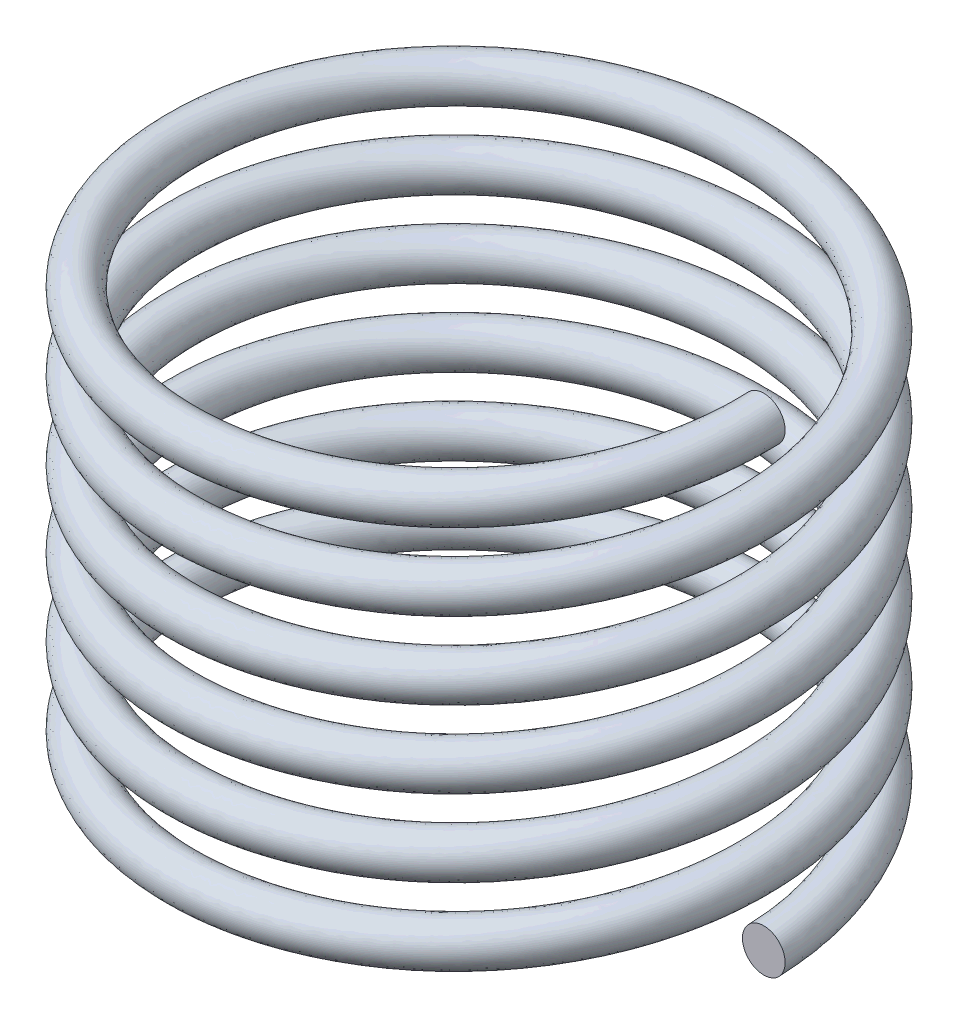
ISO-10303-21;
HEADER;
FILE_DESCRIPTION(('STEP AP214'),'2;1');
FILE_NAME('part.step','',(''),(''),'','','');
FILE_SCHEMA(('AUTOMOTIVE_DESIGN { 1 0 10303 214 1 1 1 1 }'));
ENDSEC;
DATA;
#1=APPLICATION_CONTEXT('core data for automotive mechanical design processes');
#2=APPLICATION_PROTOCOL_DEFINITION('international standard','automotive_design',2000,#1);
#3=PRODUCT_CONTEXT('',#1,'mechanical');
#4=PRODUCT('Part','Part','',(#3));
#5=PRODUCT_RELATED_PRODUCT_CATEGORY('part','',(#4));
#6=PRODUCT_DEFINITION_FORMATION('','',#4);
#7=PRODUCT_DEFINITION_CONTEXT('part definition',#1,'design');
#8=PRODUCT_DEFINITION('design','',#6,#7);
#9=PRODUCT_DEFINITION_SHAPE('','',#8);
#10=(LENGTH_UNIT() NAMED_UNIT(*) SI_UNIT(.MILLI.,.METRE.));
#11=(NAMED_UNIT(*) PLANE_ANGLE_UNIT() SI_UNIT($,.RADIAN.));
#12=(NAMED_UNIT(*) SI_UNIT($,.STERADIAN.) SOLID_ANGLE_UNIT());
#13=UNCERTAINTY_MEASURE_WITH_UNIT(LENGTH_MEASURE(1.E-05),#10,'distance_accuracy_value','');
#14=(GEOMETRIC_REPRESENTATION_CONTEXT(3) GLOBAL_UNCERTAINTY_ASSIGNED_CONTEXT((#13)) GLOBAL_UNIT_ASSIGNED_CONTEXT((#10,
#11,#12)) REPRESENTATION_CONTEXT('',''));
#15=CARTESIAN_POINT('',(0.,0.,0.));
#16=DIRECTION('',(0.,0.,1.));
#17=DIRECTION('',(1.,0.,0.));
#18=AXIS2_PLACEMENT_3D('',#15,#16,#17);
#19=CARTESIAN_POINT('',(11.3409090909091,13.8094886875501,0.));
#20=DIRECTION('',(0.,0.,1.));
#21=DIRECTION('',(1.,0.,0.));
#22=AXIS2_PLACEMENT_3D('',#19,#20,#21);
#23=PLANE('',#22);
#24=CARTESIAN_POINT('',(11.3409090909091,13.8094886875501,0.));
#25=DIRECTION('',(0.,0.,1.));
#26=DIRECTION('',(1.,0.,0.));
#27=AXIS2_PLACEMENT_3D('',#24,#25,#26);
#28=CIRCLE('',#27,1.5);
#29=CARTESIAN_POINT('',(12.8409090909091,13.8094886875501,0.));
#30=VERTEX_POINT('',#29);
#31=EDGE_CURVE('E39',#30,#30,#28,.T.);
#32=ORIENTED_EDGE('',*,*,#31,.F.);
#33=EDGE_LOOP('',(#32));
#34=FACE_BOUND('',#33,.T.);
#35=ADVANCED_FACE('F33',(#34),#23,.F.);
#36=CARTESIAN_POINT('',(11.3409090909091,-18.5768749488135,1.6759110426447E-12));
#37=DIRECTION('',(0.,0.,1.));
#38=DIRECTION('',(1.,0.,0.));
#39=AXIS2_PLACEMENT_3D('',#36,#37,#38);
#40=PLANE('',#39);
#41=CARTESIAN_POINT('',(11.3409090909091,-18.5768749488135,1.6759110426447E-12));
#42=DIRECTION('',(0.,0.,1.));
#43=DIRECTION('',(1.,0.,0.));
#44=AXIS2_PLACEMENT_3D('',#41,#42,#43);
#45=CIRCLE('',#44,1.5);
#46=CARTESIAN_POINT('',(12.8409090909091,-18.5768749488135,1.80160437084306E-12));
#47=VERTEX_POINT('',#46);
#48=EDGE_CURVE('E10',#47,#47,#45,.T.);
#49=ORIENTED_EDGE('',*,*,#48,.T.);
#50=EDGE_LOOP('',(#49));
#51=FACE_BOUND('',#50,.T.);
#52=ADVANCED_FACE('F48',(#51),#40,.T.);
#53=CARTESIAN_POINT('',(12.8409090909091,13.8094886875501,0.));
#54=CARTESIAN_POINT('',(12.8409090909091,13.3596780814895,12.413030787577));
#55=CARTESIAN_POINT('',(2.0909090909091,12.9098674754289,18.6195461813654));
#56=CARTESIAN_POINT('',(-8.6590909090909,12.4600568693683,24.8260615751539));
#57=CARTESIAN_POINT('',(-19.4090909090909,12.0102462633077,18.6195461813654));
#58=CARTESIAN_POINT('',(-30.1590909090909,11.5604356572471,12.413030787577));
#59=CARTESIAN_POINT('',(-30.1590909090909,11.1106250511865,0.));
#60=CARTESIAN_POINT('',(-30.1590909090909,10.6608144451259,-12.4130307875769));
#61=CARTESIAN_POINT('',(-19.4090909090909,10.2110038390653,-18.6195461813654));
#62=CARTESIAN_POINT('',(-8.65909090909091,9.76119323300465,-24.8260615751539));
#63=CARTESIAN_POINT('',(2.09090909090908,9.31138262694405,-18.6195461813654));
#64=CARTESIAN_POINT('',(12.8409090909091,8.86157202088344,-12.413030787577));
#65=CARTESIAN_POINT('',(12.8409090909091,8.41176141482284,0.));
#66=CARTESIAN_POINT('',(12.8409090909091,7.96195080876223,12.413030787577));
#67=CARTESIAN_POINT('',(2.0909090909091,7.51214020270163,18.6195461813654));
#68=CARTESIAN_POINT('',(-8.6590909090909,7.06232959664102,24.8260615751539));
#69=CARTESIAN_POINT('',(-19.4090909090909,6.61251899058042,18.6195461813654));
#70=CARTESIAN_POINT('',(-30.1590909090909,6.16270838451981,12.413030787577));
#71=CARTESIAN_POINT('',(-30.1590909090909,5.71289777845921,0.));
#72=CARTESIAN_POINT('',(-30.1590909090909,5.2630871723986,-12.4130307875769));
#73=CARTESIAN_POINT('',(-19.4090909090909,4.813276566338,-18.6195461813654));
#74=CARTESIAN_POINT('',(-8.65909090909091,4.3634659602774,-24.8260615751539));
#75=CARTESIAN_POINT('',(2.09090909090908,3.91365535421679,-18.6195461813654));
#76=CARTESIAN_POINT('',(12.8409090909091,3.46384474815619,-12.413030787577));
#77=CARTESIAN_POINT('',(12.8409090909091,3.01403414209558,0.));
#78=CARTESIAN_POINT('',(12.8409090909091,2.56422353603498,12.413030787577));
#79=CARTESIAN_POINT('',(2.0909090909091,2.11441292997438,18.6195461813654));
#80=CARTESIAN_POINT('',(-8.6590909090909,1.66460232391377,24.8260615751539));
#81=CARTESIAN_POINT('',(-19.4090909090909,1.21479171785317,18.6195461813654));
#82=CARTESIAN_POINT('',(-30.1590909090909,0.764981111792563,12.413030787577));
#83=CARTESIAN_POINT('',(-30.1590909090909,0.315170505731958,0.));
#84=CARTESIAN_POINT('',(-30.1590909090909,-0.134640100328647,-12.4130307875769));
#85=CARTESIAN_POINT('',(-19.4090909090909,-0.584450706389251,-18.6195461813654));
#86=CARTESIAN_POINT('',(-8.65909090909091,-1.03426131244986,-24.8260615751539));
#87=CARTESIAN_POINT('',(2.09090909090908,-1.48407191851046,-18.6195461813654));
#88=CARTESIAN_POINT('',(12.8409090909091,-1.93388252457106,-12.413030787577));
#89=CARTESIAN_POINT('',(12.8409090909091,-2.38369313063167,0.));
#90=CARTESIAN_POINT('',(12.8409090909091,-2.83350373669227,12.413030787577));
#91=CARTESIAN_POINT('',(2.0909090909091,-3.28331434275288,18.6195461813654));
#92=CARTESIAN_POINT('',(-8.6590909090909,-3.73312494881348,24.8260615751539));
#93=CARTESIAN_POINT('',(-19.4090909090909,-4.18293555487409,18.6195461813654));
#94=CARTESIAN_POINT('',(-30.1590909090909,-4.63274616093469,12.413030787577));
#95=CARTESIAN_POINT('',(-30.1590909090909,-5.08255676699529,0.));
#96=CARTESIAN_POINT('',(-30.1590909090909,-5.5323673730559,-12.4130307875769));
#97=CARTESIAN_POINT('',(-19.4090909090909,-5.9821779791165,-18.6195461813654));
#98=CARTESIAN_POINT('',(-8.65909090909091,-6.43198858517711,-24.8260615751539));
#99=CARTESIAN_POINT('',(2.09090909090908,-6.88179919123771,-18.6195461813654));
#100=CARTESIAN_POINT('',(12.8409090909091,-7.33160979729832,-12.413030787577));
#101=CARTESIAN_POINT('',(12.8409090909091,-7.78142040335892,0.));
#102=CARTESIAN_POINT('',(12.8409090909091,-8.23123100941952,12.413030787577));
#103=CARTESIAN_POINT('',(2.0909090909091,-8.68104161548013,18.6195461813654));
#104=CARTESIAN_POINT('',(-8.6590909090909,-9.13085222154073,24.8260615751539));
#105=CARTESIAN_POINT('',(-19.4090909090909,-9.58066282760134,18.6195461813654));
#106=CARTESIAN_POINT('',(-30.1590909090909,-10.0304734336619,12.413030787577));
#107=CARTESIAN_POINT('',(-30.1590909090909,-10.4802840397225,0.));
#108=CARTESIAN_POINT('',(-30.1590909090909,-10.9300946457832,-12.4130307875769));
#109=CARTESIAN_POINT('',(-19.4090909090909,-11.3799052518438,-18.6195461813654));
#110=CARTESIAN_POINT('',(-8.65909090909091,-11.8297158579044,-24.8260615751539));
#111=CARTESIAN_POINT('',(2.09090909090908,-12.279526463965,-18.6195461813654));
#112=CARTESIAN_POINT('',(12.8409090909091,-12.7293370700256,-12.413030787577));
#113=CARTESIAN_POINT('',(12.8409090909091,-13.1791476760862,0.));
#114=CARTESIAN_POINT('',(12.8409090909091,-13.6289582821468,12.413030787577));
#115=CARTESIAN_POINT('',(2.0909090909091,-14.0787688882074,18.6195461813654));
#116=CARTESIAN_POINT('',(-8.6590909090909,-14.528579494268,24.8260615751539));
#117=CARTESIAN_POINT('',(-19.4090909090909,-14.9783901003286,18.6195461813654));
#118=CARTESIAN_POINT('',(-30.1590909090909,-15.4282007063892,12.413030787577));
#119=CARTESIAN_POINT('',(-30.1590909090909,-15.8780113124498,0.));
#120=CARTESIAN_POINT('',(-30.1590909090909,-16.3278219185104,-12.4130307875769));
#121=CARTESIAN_POINT('',(-19.4090909090909,-16.777632524571,-18.6195461813654));
#122=CARTESIAN_POINT('',(-8.65909090909091,-17.2274431306316,-24.8260615751539));
#123=CARTESIAN_POINT('',(2.09090909090908,-17.6772537366922,-18.6195461813654));
#124=CARTESIAN_POINT('',(12.8409090909091,-18.1270643427528,-12.413030787577));
#125=CARTESIAN_POINT('',(12.8409090909091,-18.5768749488134,0.));
#126=CARTESIAN_POINT('',(12.8409090909091,16.8094886875501,0.));
#127=CARTESIAN_POINT('',(12.8409090909091,16.3596780814895,12.413030787577));
#128=CARTESIAN_POINT('',(2.0909090909091,15.9098674754289,18.6195461813654));
#129=CARTESIAN_POINT('',(-8.6590909090909,15.4600568693683,24.8260615751539));
#130=CARTESIAN_POINT('',(-19.4090909090909,15.0102462633077,18.6195461813654));
#131=CARTESIAN_POINT('',(-30.1590909090909,14.5604356572471,12.413030787577));
#132=CARTESIAN_POINT('',(-30.1590909090909,14.1106250511865,0.));
#133=CARTESIAN_POINT('',(-30.1590909090909,13.6608144451259,-12.4130307875769));
#134=CARTESIAN_POINT('',(-19.4090909090909,13.2110038390653,-18.6195461813654));
#135=CARTESIAN_POINT('',(-8.65909090909091,12.7611932330046,-24.8260615751539));
#136=CARTESIAN_POINT('',(2.09090909090908,12.311382626944,-18.6195461813654));
#137=CARTESIAN_POINT('',(12.8409090909091,11.8615720208834,-12.413030787577));
#138=CARTESIAN_POINT('',(12.8409090909091,11.4117614148228,0.));
#139=CARTESIAN_POINT('',(12.8409090909091,10.9619508087622,12.413030787577));
#140=CARTESIAN_POINT('',(2.0909090909091,10.5121402027016,18.6195461813654));
#141=CARTESIAN_POINT('',(-8.6590909090909,10.062329596641,24.8260615751539));
#142=CARTESIAN_POINT('',(-19.4090909090909,9.61251899058042,18.6195461813654));
#143=CARTESIAN_POINT('',(-30.1590909090909,9.16270838451981,12.413030787577));
#144=CARTESIAN_POINT('',(-30.1590909090909,8.71289777845921,0.));
#145=CARTESIAN_POINT('',(-30.1590909090909,8.2630871723986,-12.4130307875769));
#146=CARTESIAN_POINT('',(-19.4090909090909,7.813276566338,-18.6195461813654));
#147=CARTESIAN_POINT('',(-8.65909090909091,7.36346596027739,-24.8260615751539));
#148=CARTESIAN_POINT('',(2.09090909090908,6.91365535421679,-18.6195461813654));
#149=CARTESIAN_POINT('',(12.8409090909091,6.46384474815619,-12.413030787577));
#150=CARTESIAN_POINT('',(12.8409090909091,6.01403414209558,0.));
#151=CARTESIAN_POINT('',(12.8409090909091,5.56422353603498,12.413030787577));
#152=CARTESIAN_POINT('',(2.0909090909091,5.11441292997437,18.6195461813654));
#153=CARTESIAN_POINT('',(-8.6590909090909,4.66460232391377,24.8260615751539));
#154=CARTESIAN_POINT('',(-19.4090909090909,4.21479171785316,18.6195461813654));
#155=CARTESIAN_POINT('',(-30.1590909090909,3.76498111179256,12.413030787577));
#156=CARTESIAN_POINT('',(-30.1590909090909,3.31517050573196,0.));
#157=CARTESIAN_POINT('',(-30.1590909090909,2.86535989967135,-12.4130307875769));
#158=CARTESIAN_POINT('',(-19.4090909090909,2.41554929361075,-18.6195461813654));
#159=CARTESIAN_POINT('',(-8.65909090909091,1.96573868755014,-24.8260615751539));
#160=CARTESIAN_POINT('',(2.09090909090908,1.51592808148954,-18.6195461813654));
#161=CARTESIAN_POINT('',(12.8409090909091,1.06611747542893,-12.413030787577));
#162=CARTESIAN_POINT('',(12.8409090909091,0.616306869368328,0.));
#163=CARTESIAN_POINT('',(12.8409090909091,0.166496263307725,12.413030787577));
#164=CARTESIAN_POINT('',(2.0909090909091,-0.283314342752881,18.6195461813654));
#165=CARTESIAN_POINT('',(-8.6590909090909,-0.733124948813484,24.8260615751539));
#166=CARTESIAN_POINT('',(-19.4090909090909,-1.18293555487409,18.6195461813654));
#167=CARTESIAN_POINT('',(-30.1590909090909,-1.63274616093469,12.413030787577));
#168=CARTESIAN_POINT('',(-30.1590909090909,-2.0825567669953,0.));
#169=CARTESIAN_POINT('',(-30.1590909090909,-2.5323673730559,-12.4130307875769));
#170=CARTESIAN_POINT('',(-19.4090909090909,-2.98217797911651,-18.6195461813654));
#171=CARTESIAN_POINT('',(-8.65909090909091,-3.43198858517711,-24.8260615751539));
#172=CARTESIAN_POINT('',(2.09090909090908,-3.88179919123772,-18.6195461813654));
#173=CARTESIAN_POINT('',(12.8409090909091,-4.33160979729832,-12.413030787577));
#174=CARTESIAN_POINT('',(12.8409090909091,-4.78142040335892,0.));
#175=CARTESIAN_POINT('',(12.8409090909091,-5.23123100941953,12.413030787577));
#176=CARTESIAN_POINT('',(2.0909090909091,-5.68104161548013,18.6195461813654));
#177=CARTESIAN_POINT('',(-8.6590909090909,-6.13085222154074,24.8260615751539));
#178=CARTESIAN_POINT('',(-19.4090909090909,-6.58066282760134,18.6195461813654));
#179=CARTESIAN_POINT('',(-30.1590909090909,-7.03047343366195,12.413030787577));
#180=CARTESIAN_POINT('',(-30.1590909090909,-7.48028403972255,0.));
#181=CARTESIAN_POINT('',(-30.1590909090909,-7.93009464578315,-12.4130307875769));
#182=CARTESIAN_POINT('',(-19.4090909090909,-8.37990525184376,-18.6195461813654));
#183=CARTESIAN_POINT('',(-8.65909090909091,-8.82971585790436,-24.8260615751539));
#184=CARTESIAN_POINT('',(2.09090909090908,-9.27952646396497,-18.6195461813654));
#185=CARTESIAN_POINT('',(12.8409090909091,-9.72933707002557,-12.413030787577));
#186=CARTESIAN_POINT('',(12.8409090909091,-10.1791476760862,0.));
#187=CARTESIAN_POINT('',(12.8409090909091,-10.6289582821468,12.413030787577));
#188=CARTESIAN_POINT('',(2.0909090909091,-11.0787688882074,18.6195461813654));
#189=CARTESIAN_POINT('',(-8.6590909090909,-11.528579494268,24.8260615751539));
#190=CARTESIAN_POINT('',(-19.4090909090909,-11.9783901003286,18.6195461813654));
#191=CARTESIAN_POINT('',(-30.1590909090909,-12.4282007063892,12.413030787577));
#192=CARTESIAN_POINT('',(-30.1590909090909,-12.8780113124498,0.));
#193=CARTESIAN_POINT('',(-30.1590909090909,-13.3278219185104,-12.4130307875769));
#194=CARTESIAN_POINT('',(-19.4090909090909,-13.777632524571,-18.6195461813654));
#195=CARTESIAN_POINT('',(-8.65909090909091,-14.2274431306316,-24.8260615751539));
#196=CARTESIAN_POINT('',(2.09090909090908,-14.6772537366922,-18.6195461813654));
#197=CARTESIAN_POINT('',(12.8409090909091,-15.1270643427528,-12.413030787577));
#198=CARTESIAN_POINT('',(12.8409090909091,-15.5768749488134,0.));
#199=CARTESIAN_POINT('',(9.8409090909091,16.8094886875501,0.));
#200=CARTESIAN_POINT('',(9.8409090909091,16.3596780814895,10.6809799800081));
#201=CARTESIAN_POINT('',(0.5909090909091,15.9098674754289,16.0214699700121));
#202=CARTESIAN_POINT('',(-8.6590909090909,15.4600568693683,21.3619599600162));
#203=CARTESIAN_POINT('',(-17.9090909090909,15.0102462633077,16.0214699700121));
#204=CARTESIAN_POINT('',(-27.1590909090909,14.5604356572471,10.6809799800081));
#205=CARTESIAN_POINT('',(-27.1590909090909,14.1106250511865,0.));
#206=CARTESIAN_POINT('',(-27.1590909090909,13.6608144451259,-10.6809799800081));
#207=CARTESIAN_POINT('',(-17.9090909090909,13.2110038390653,-16.0214699700121));
#208=CARTESIAN_POINT('',(-8.65909090909091,12.7611932330046,-21.3619599600162));
#209=CARTESIAN_POINT('',(0.590909090909086,12.311382626944,-16.0214699700121));
#210=CARTESIAN_POINT('',(9.84090909090909,11.8615720208834,-10.6809799800081));
#211=CARTESIAN_POINT('',(9.8409090909091,11.4117614148228,0.));
#212=CARTESIAN_POINT('',(9.8409090909091,10.9619508087622,10.6809799800081));
#213=CARTESIAN_POINT('',(0.5909090909091,10.5121402027016,16.0214699700121));
#214=CARTESIAN_POINT('',(-8.6590909090909,10.062329596641,21.3619599600162));
#215=CARTESIAN_POINT('',(-17.9090909090909,9.61251899058042,16.0214699700121));
#216=CARTESIAN_POINT('',(-27.1590909090909,9.16270838451981,10.6809799800081));
#217=CARTESIAN_POINT('',(-27.1590909090909,8.71289777845921,0.));
#218=CARTESIAN_POINT('',(-27.1590909090909,8.2630871723986,-10.6809799800081));
#219=CARTESIAN_POINT('',(-17.9090909090909,7.813276566338,-16.0214699700121));
#220=CARTESIAN_POINT('',(-8.65909090909091,7.36346596027739,-21.3619599600162));
#221=CARTESIAN_POINT('',(0.590909090909086,6.91365535421679,-16.0214699700121));
#222=CARTESIAN_POINT('',(9.84090909090909,6.46384474815619,-10.6809799800081));
#223=CARTESIAN_POINT('',(9.8409090909091,6.01403414209558,0.));
#224=CARTESIAN_POINT('',(9.8409090909091,5.56422353603498,10.6809799800081));
#225=CARTESIAN_POINT('',(0.5909090909091,5.11441292997437,16.0214699700121));
#226=CARTESIAN_POINT('',(-8.6590909090909,4.66460232391377,21.3619599600162));
#227=CARTESIAN_POINT('',(-17.9090909090909,4.21479171785316,16.0214699700121));
#228=CARTESIAN_POINT('',(-27.1590909090909,3.76498111179256,10.6809799800081));
#229=CARTESIAN_POINT('',(-27.1590909090909,3.31517050573196,0.));
#230=CARTESIAN_POINT('',(-27.1590909090909,2.86535989967135,-10.6809799800081));
#231=CARTESIAN_POINT('',(-17.9090909090909,2.41554929361075,-16.0214699700121));
#232=CARTESIAN_POINT('',(-8.65909090909091,1.96573868755014,-21.3619599600162));
#233=CARTESIAN_POINT('',(0.590909090909086,1.51592808148954,-16.0214699700121));
#234=CARTESIAN_POINT('',(9.84090909090909,1.06611747542893,-10.6809799800081));
#235=CARTESIAN_POINT('',(9.8409090909091,0.616306869368328,0.));
#236=CARTESIAN_POINT('',(9.8409090909091,0.166496263307725,10.6809799800081));
#237=CARTESIAN_POINT('',(0.5909090909091,-0.283314342752881,16.0214699700121));
#238=CARTESIAN_POINT('',(-8.6590909090909,-0.733124948813484,21.3619599600162));
#239=CARTESIAN_POINT('',(-17.9090909090909,-1.18293555487409,16.0214699700121));
#240=CARTESIAN_POINT('',(-27.1590909090909,-1.63274616093469,10.6809799800081));
#241=CARTESIAN_POINT('',(-27.1590909090909,-2.0825567669953,0.));
#242=CARTESIAN_POINT('',(-27.1590909090909,-2.5323673730559,-10.6809799800081));
#243=CARTESIAN_POINT('',(-17.9090909090909,-2.98217797911651,-16.0214699700121));
#244=CARTESIAN_POINT('',(-8.65909090909091,-3.43198858517711,-21.3619599600162));
#245=CARTESIAN_POINT('',(0.590909090909086,-3.88179919123772,-16.0214699700121));
#246=CARTESIAN_POINT('',(9.84090909090909,-4.33160979729832,-10.6809799800081));
#247=CARTESIAN_POINT('',(9.8409090909091,-4.78142040335892,0.));
#248=CARTESIAN_POINT('',(9.8409090909091,-5.23123100941953,10.6809799800081));
#249=CARTESIAN_POINT('',(0.5909090909091,-5.68104161548013,16.0214699700121));
#250=CARTESIAN_POINT('',(-8.6590909090909,-6.13085222154074,21.3619599600162));
#251=CARTESIAN_POINT('',(-17.9090909090909,-6.58066282760134,16.0214699700121));
#252=CARTESIAN_POINT('',(-27.1590909090909,-7.03047343366195,10.6809799800081));
#253=CARTESIAN_POINT('',(-27.1590909090909,-7.48028403972255,0.));
#254=CARTESIAN_POINT('',(-27.1590909090909,-7.93009464578315,-10.6809799800081));
#255=CARTESIAN_POINT('',(-17.9090909090909,-8.37990525184376,-16.0214699700121));
#256=CARTESIAN_POINT('',(-8.65909090909091,-8.82971585790436,-21.3619599600162));
#257=CARTESIAN_POINT('',(0.590909090909086,-9.27952646396497,-16.0214699700121));
#258=CARTESIAN_POINT('',(9.84090909090909,-9.72933707002557,-10.6809799800081));
#259=CARTESIAN_POINT('',(9.8409090909091,-10.1791476760862,0.));
#260=CARTESIAN_POINT('',(9.8409090909091,-10.6289582821468,10.6809799800081));
#261=CARTESIAN_POINT('',(0.5909090909091,-11.0787688882074,16.0214699700121));
#262=CARTESIAN_POINT('',(-8.6590909090909,-11.528579494268,21.3619599600162));
#263=CARTESIAN_POINT('',(-17.9090909090909,-11.9783901003286,16.0214699700121));
#264=CARTESIAN_POINT('',(-27.1590909090909,-12.4282007063892,10.6809799800081));
#265=CARTESIAN_POINT('',(-27.1590909090909,-12.8780113124498,0.));
#266=CARTESIAN_POINT('',(-27.1590909090909,-13.3278219185104,-10.6809799800081));
#267=CARTESIAN_POINT('',(-17.9090909090909,-13.777632524571,-16.0214699700121));
#268=CARTESIAN_POINT('',(-8.65909090909091,-14.2274431306316,-21.3619599600162));
#269=CARTESIAN_POINT('',(0.590909090909086,-14.6772537366922,-16.0214699700121));
#270=CARTESIAN_POINT('',(9.84090909090909,-15.1270643427528,-10.6809799800081));
#271=CARTESIAN_POINT('',(9.8409090909091,-15.5768749488134,0.));
#272=CARTESIAN_POINT('',(9.8409090909091,13.8094886875501,0.));
#273=CARTESIAN_POINT('',(9.8409090909091,13.3596780814895,10.6809799800081));
#274=CARTESIAN_POINT('',(0.5909090909091,12.9098674754289,16.0214699700121));
#275=CARTESIAN_POINT('',(-8.6590909090909,12.4600568693683,21.3619599600162));
#276=CARTESIAN_POINT('',(-17.9090909090909,12.0102462633077,16.0214699700121));
#277=CARTESIAN_POINT('',(-27.1590909090909,11.5604356572471,10.6809799800081));
#278=CARTESIAN_POINT('',(-27.1590909090909,11.1106250511865,0.));
#279=CARTESIAN_POINT('',(-27.1590909090909,10.6608144451259,-10.6809799800081));
#280=CARTESIAN_POINT('',(-17.9090909090909,10.2110038390653,-16.0214699700121));
#281=CARTESIAN_POINT('',(-8.65909090909091,9.76119323300465,-21.3619599600162));
#282=CARTESIAN_POINT('',(0.590909090909086,9.31138262694405,-16.0214699700121));
#283=CARTESIAN_POINT('',(9.84090909090909,8.86157202088344,-10.6809799800081));
#284=CARTESIAN_POINT('',(9.8409090909091,8.41176141482284,0.));
#285=CARTESIAN_POINT('',(9.8409090909091,7.96195080876223,10.6809799800081));
#286=CARTESIAN_POINT('',(0.5909090909091,7.51214020270163,16.0214699700121));
#287=CARTESIAN_POINT('',(-8.6590909090909,7.06232959664102,21.3619599600162));
#288=CARTESIAN_POINT('',(-17.9090909090909,6.61251899058042,16.0214699700121));
#289=CARTESIAN_POINT('',(-27.1590909090909,6.16270838451981,10.6809799800081));
#290=CARTESIAN_POINT('',(-27.1590909090909,5.71289777845921,0.));
#291=CARTESIAN_POINT('',(-27.1590909090909,5.2630871723986,-10.6809799800081));
#292=CARTESIAN_POINT('',(-17.9090909090909,4.813276566338,-16.0214699700121));
#293=CARTESIAN_POINT('',(-8.65909090909091,4.3634659602774,-21.3619599600162));
#294=CARTESIAN_POINT('',(0.590909090909086,3.91365535421679,-16.0214699700121));
#295=CARTESIAN_POINT('',(9.84090909090909,3.46384474815619,-10.6809799800081));
#296=CARTESIAN_POINT('',(9.8409090909091,3.01403414209558,0.));
#297=CARTESIAN_POINT('',(9.8409090909091,2.56422353603498,10.6809799800081));
#298=CARTESIAN_POINT('',(0.5909090909091,2.11441292997438,16.0214699700121));
#299=CARTESIAN_POINT('',(-8.6590909090909,1.66460232391377,21.3619599600162));
#300=CARTESIAN_POINT('',(-17.9090909090909,1.21479171785317,16.0214699700121));
#301=CARTESIAN_POINT('',(-27.1590909090909,0.764981111792563,10.6809799800081));
#302=CARTESIAN_POINT('',(-27.1590909090909,0.315170505731958,0.));
#303=CARTESIAN_POINT('',(-27.1590909090909,-0.134640100328647,-10.6809799800081));
#304=CARTESIAN_POINT('',(-17.9090909090909,-0.584450706389251,-16.0214699700121));
#305=CARTESIAN_POINT('',(-8.65909090909091,-1.03426131244986,-21.3619599600162));
#306=CARTESIAN_POINT('',(0.590909090909086,-1.48407191851046,-16.0214699700121));
#307=CARTESIAN_POINT('',(9.84090909090909,-1.93388252457106,-10.6809799800081));
#308=CARTESIAN_POINT('',(9.8409090909091,-2.38369313063167,0.));
#309=CARTESIAN_POINT('',(9.8409090909091,-2.83350373669227,10.6809799800081));
#310=CARTESIAN_POINT('',(0.5909090909091,-3.28331434275288,16.0214699700121));
#311=CARTESIAN_POINT('',(-8.6590909090909,-3.73312494881348,21.3619599600162));
#312=CARTESIAN_POINT('',(-17.9090909090909,-4.18293555487409,16.0214699700121));
#313=CARTESIAN_POINT('',(-27.1590909090909,-4.63274616093469,10.6809799800081));
#314=CARTESIAN_POINT('',(-27.1590909090909,-5.08255676699529,0.));
#315=CARTESIAN_POINT('',(-27.1590909090909,-5.5323673730559,-10.6809799800081));
#316=CARTESIAN_POINT('',(-17.9090909090909,-5.9821779791165,-16.0214699700121));
#317=CARTESIAN_POINT('',(-8.65909090909091,-6.43198858517711,-21.3619599600162));
#318=CARTESIAN_POINT('',(0.590909090909086,-6.88179919123771,-16.0214699700121));
#319=CARTESIAN_POINT('',(9.84090909090909,-7.33160979729832,-10.6809799800081));
#320=CARTESIAN_POINT('',(9.8409090909091,-7.78142040335892,0.));
#321=CARTESIAN_POINT('',(9.8409090909091,-8.23123100941952,10.6809799800081));
#322=CARTESIAN_POINT('',(0.5909090909091,-8.68104161548013,16.0214699700121));
#323=CARTESIAN_POINT('',(-8.6590909090909,-9.13085222154073,21.3619599600162));
#324=CARTESIAN_POINT('',(-17.9090909090909,-9.58066282760134,16.0214699700121));
#325=CARTESIAN_POINT('',(-27.1590909090909,-10.0304734336619,10.6809799800081));
#326=CARTESIAN_POINT('',(-27.1590909090909,-10.4802840397225,0.));
#327=CARTESIAN_POINT('',(-27.1590909090909,-10.9300946457832,-10.6809799800081));
#328=CARTESIAN_POINT('',(-17.9090909090909,-11.3799052518438,-16.0214699700121));
#329=CARTESIAN_POINT('',(-8.65909090909091,-11.8297158579044,-21.3619599600162));
#330=CARTESIAN_POINT('',(0.590909090909086,-12.279526463965,-16.0214699700121));
#331=CARTESIAN_POINT('',(9.84090909090909,-12.7293370700256,-10.6809799800081));
#332=CARTESIAN_POINT('',(9.8409090909091,-13.1791476760862,0.));
#333=CARTESIAN_POINT('',(9.8409090909091,-13.6289582821468,10.6809799800081));
#334=CARTESIAN_POINT('',(0.5909090909091,-14.0787688882074,16.0214699700121));
#335=CARTESIAN_POINT('',(-8.6590909090909,-14.528579494268,21.3619599600162));
#336=CARTESIAN_POINT('',(-17.9090909090909,-14.9783901003286,16.0214699700121));
#337=CARTESIAN_POINT('',(-27.1590909090909,-15.4282007063892,10.6809799800081));
#338=CARTESIAN_POINT('',(-27.1590909090909,-15.8780113124498,0.));
#339=CARTESIAN_POINT('',(-27.1590909090909,-16.3278219185104,-10.6809799800081));
#340=CARTESIAN_POINT('',(-17.9090909090909,-16.777632524571,-16.0214699700121));
#341=CARTESIAN_POINT('',(-8.65909090909091,-17.2274431306316,-21.3619599600162));
#342=CARTESIAN_POINT('',(0.590909090909086,-17.6772537366922,-16.0214699700121));
#343=CARTESIAN_POINT('',(9.84090909090909,-18.1270643427528,-10.6809799800081));
#344=CARTESIAN_POINT('',(9.8409090909091,-18.5768749488134,0.));
#345=CARTESIAN_POINT('',(9.8409090909091,10.8094886875501,0.));
#346=CARTESIAN_POINT('',(9.8409090909091,10.3596780814895,10.6809799800081));
#347=CARTESIAN_POINT('',(0.5909090909091,9.90986747542888,16.0214699700121));
#348=CARTESIAN_POINT('',(-8.6590909090909,9.46005686936828,21.3619599600162));
#349=CARTESIAN_POINT('',(-17.9090909090909,9.01024626330767,16.0214699700121));
#350=CARTESIAN_POINT('',(-27.1590909090909,8.56043565724707,10.6809799800081));
#351=CARTESIAN_POINT('',(-27.1590909090909,8.11062505118647,0.));
#352=CARTESIAN_POINT('',(-27.1590909090909,7.66081444512586,-10.6809799800081));
#353=CARTESIAN_POINT('',(-17.9090909090909,7.21100383906526,-16.0214699700121));
#354=CARTESIAN_POINT('',(-8.65909090909091,6.76119323300465,-21.3619599600162));
#355=CARTESIAN_POINT('',(0.590909090909086,6.31138262694405,-16.0214699700121));
#356=CARTESIAN_POINT('',(9.84090909090909,5.86157202088344,-10.6809799800081));
#357=CARTESIAN_POINT('',(9.8409090909091,5.41176141482284,0.));
#358=CARTESIAN_POINT('',(9.8409090909091,4.96195080876223,10.6809799800081));
#359=CARTESIAN_POINT('',(0.5909090909091,4.51214020270163,16.0214699700121));
#360=CARTESIAN_POINT('',(-8.6590909090909,4.06232959664103,21.3619599600162));
#361=CARTESIAN_POINT('',(-17.9090909090909,3.61251899058042,16.0214699700121));
#362=CARTESIAN_POINT('',(-27.1590909090909,3.16270838451982,10.6809799800081));
#363=CARTESIAN_POINT('',(-27.1590909090909,2.71289777845921,0.));
#364=CARTESIAN_POINT('',(-27.1590909090909,2.26308717239861,-10.6809799800081));
#365=CARTESIAN_POINT('',(-17.9090909090909,1.813276566338,-16.0214699700121));
#366=CARTESIAN_POINT('',(-8.65909090909091,1.3634659602774,-21.3619599600162));
#367=CARTESIAN_POINT('',(0.590909090909086,0.913655354216796,-16.0214699700121));
#368=CARTESIAN_POINT('',(9.84090909090909,0.463844748156191,-10.6809799800081));
#369=CARTESIAN_POINT('',(9.8409090909091,0.0140341420955866,0.));
#370=CARTESIAN_POINT('',(9.8409090909091,-0.435776463965018,10.6809799800081));
#371=CARTESIAN_POINT('',(0.5909090909091,-0.885587070025623,16.0214699700121));
#372=CARTESIAN_POINT('',(-8.6590909090909,-1.33539767608623,21.3619599600162));
#373=CARTESIAN_POINT('',(-17.9090909090909,-1.78520828214683,16.0214699700121));
#374=CARTESIAN_POINT('',(-27.1590909090909,-2.23501888820744,10.6809799800081));
#375=CARTESIAN_POINT('',(-27.1590909090909,-2.68482949426804,0.));
#376=CARTESIAN_POINT('',(-27.1590909090909,-3.13464010032864,-10.6809799800081));
#377=CARTESIAN_POINT('',(-17.9090909090909,-3.58445070638925,-16.0214699700121));
#378=CARTESIAN_POINT('',(-8.65909090909091,-4.03426131244985,-21.3619599600162));
#379=CARTESIAN_POINT('',(0.590909090909086,-4.48407191851046,-16.0214699700121));
#380=CARTESIAN_POINT('',(9.84090909090909,-4.93388252457106,-10.6809799800081));
#381=CARTESIAN_POINT('',(9.8409090909091,-5.38369313063167,0.));
#382=CARTESIAN_POINT('',(9.8409090909091,-5.83350373669227,10.6809799800081));
#383=CARTESIAN_POINT('',(0.5909090909091,-6.28331434275288,16.0214699700121));
#384=CARTESIAN_POINT('',(-8.6590909090909,-6.73312494881348,21.3619599600162));
#385=CARTESIAN_POINT('',(-17.9090909090909,-7.18293555487409,16.0214699700121));
#386=CARTESIAN_POINT('',(-27.1590909090909,-7.63274616093469,10.6809799800081));
#387=CARTESIAN_POINT('',(-27.1590909090909,-8.08255676699529,0.));
#388=CARTESIAN_POINT('',(-27.1590909090909,-8.5323673730559,-10.6809799800081));
#389=CARTESIAN_POINT('',(-17.9090909090909,-8.9821779791165,-16.0214699700121));
#390=CARTESIAN_POINT('',(-8.65909090909091,-9.43198858517711,-21.3619599600162));
#391=CARTESIAN_POINT('',(0.590909090909086,-9.88179919123771,-16.0214699700121));
#392=CARTESIAN_POINT('',(9.84090909090909,-10.3316097972983,-10.6809799800081));
#393=CARTESIAN_POINT('',(9.8409090909091,-10.7814204033589,0.));
#394=CARTESIAN_POINT('',(9.8409090909091,-11.2312310094195,10.6809799800081));
#395=CARTESIAN_POINT('',(0.5909090909091,-11.6810416154801,16.0214699700121));
#396=CARTESIAN_POINT('',(-8.6590909090909,-12.1308522215407,21.3619599600162));
#397=CARTESIAN_POINT('',(-17.9090909090909,-12.5806628276013,16.0214699700121));
#398=CARTESIAN_POINT('',(-27.1590909090909,-13.0304734336619,10.6809799800081));
#399=CARTESIAN_POINT('',(-27.1590909090909,-13.4802840397225,0.));
#400=CARTESIAN_POINT('',(-27.1590909090909,-13.9300946457832,-10.6809799800081));
#401=CARTESIAN_POINT('',(-17.9090909090909,-14.3799052518438,-16.0214699700121));
#402=CARTESIAN_POINT('',(-8.65909090909091,-14.8297158579044,-21.3619599600162));
#403=CARTESIAN_POINT('',(0.590909090909086,-15.279526463965,-16.0214699700121));
#404=CARTESIAN_POINT('',(9.84090909090909,-15.7293370700256,-10.6809799800081));
#405=CARTESIAN_POINT('',(9.8409090909091,-16.1791476760862,0.));
#406=CARTESIAN_POINT('',(9.8409090909091,-16.6289582821468,10.6809799800081));
#407=CARTESIAN_POINT('',(0.5909090909091,-17.0787688882074,16.0214699700121));
#408=CARTESIAN_POINT('',(-8.6590909090909,-17.528579494268,21.3619599600162));
#409=CARTESIAN_POINT('',(-17.9090909090909,-17.9783901003286,16.0214699700121));
#410=CARTESIAN_POINT('',(-27.1590909090909,-18.4282007063892,10.6809799800081));
#411=CARTESIAN_POINT('',(-27.1590909090909,-18.8780113124498,0.));
#412=CARTESIAN_POINT('',(-27.1590909090909,-19.3278219185104,-10.6809799800081));
#413=CARTESIAN_POINT('',(-17.9090909090909,-19.777632524571,-16.0214699700121));
#414=CARTESIAN_POINT('',(-8.65909090909091,-20.2274431306316,-21.3619599600162));
#415=CARTESIAN_POINT('',(0.590909090909086,-20.6772537366922,-16.0214699700121));
#416=CARTESIAN_POINT('',(9.84090909090909,-21.1270643427528,-10.6809799800081));
#417=CARTESIAN_POINT('',(9.8409090909091,-21.5768749488134,0.));
#418=CARTESIAN_POINT('',(12.8409090909091,10.8094886875501,0.));
#419=CARTESIAN_POINT('',(12.8409090909091,10.3596780814895,12.413030787577));
#420=CARTESIAN_POINT('',(2.0909090909091,9.90986747542888,18.6195461813654));
#421=CARTESIAN_POINT('',(-8.6590909090909,9.46005686936828,24.8260615751539));
#422=CARTESIAN_POINT('',(-19.4090909090909,9.01024626330767,18.6195461813654));
#423=CARTESIAN_POINT('',(-30.1590909090909,8.56043565724707,12.413030787577));
#424=CARTESIAN_POINT('',(-30.1590909090909,8.11062505118647,0.));
#425=CARTESIAN_POINT('',(-30.1590909090909,7.66081444512586,-12.4130307875769));
#426=CARTESIAN_POINT('',(-19.4090909090909,7.21100383906526,-18.6195461813654));
#427=CARTESIAN_POINT('',(-8.65909090909091,6.76119323300465,-24.8260615751539));
#428=CARTESIAN_POINT('',(2.09090909090908,6.31138262694405,-18.6195461813654));
#429=CARTESIAN_POINT('',(12.8409090909091,5.86157202088344,-12.413030787577));
#430=CARTESIAN_POINT('',(12.8409090909091,5.41176141482284,0.));
#431=CARTESIAN_POINT('',(12.8409090909091,4.96195080876223,12.413030787577));
#432=CARTESIAN_POINT('',(2.0909090909091,4.51214020270163,18.6195461813654));
#433=CARTESIAN_POINT('',(-8.6590909090909,4.06232959664103,24.8260615751539));
#434=CARTESIAN_POINT('',(-19.4090909090909,3.61251899058042,18.6195461813654));
#435=CARTESIAN_POINT('',(-30.1590909090909,3.16270838451982,12.413030787577));
#436=CARTESIAN_POINT('',(-30.1590909090909,2.71289777845921,0.));
#437=CARTESIAN_POINT('',(-30.1590909090909,2.26308717239861,-12.4130307875769));
#438=CARTESIAN_POINT('',(-19.4090909090909,1.813276566338,-18.6195461813654));
#439=CARTESIAN_POINT('',(-8.65909090909091,1.3634659602774,-24.8260615751539));
#440=CARTESIAN_POINT('',(2.09090909090908,0.913655354216796,-18.6195461813654));
#441=CARTESIAN_POINT('',(12.8409090909091,0.463844748156191,-12.413030787577));
#442=CARTESIAN_POINT('',(12.8409090909091,0.0140341420955866,0.));
#443=CARTESIAN_POINT('',(12.8409090909091,-0.435776463965018,12.413030787577));
#444=CARTESIAN_POINT('',(2.0909090909091,-0.885587070025623,18.6195461813654));
#445=CARTESIAN_POINT('',(-8.6590909090909,-1.33539767608623,24.8260615751539));
#446=CARTESIAN_POINT('',(-19.4090909090909,-1.78520828214683,18.6195461813654));
#447=CARTESIAN_POINT('',(-30.1590909090909,-2.23501888820744,12.413030787577));
#448=CARTESIAN_POINT('',(-30.1590909090909,-2.68482949426804,0.));
#449=CARTESIAN_POINT('',(-30.1590909090909,-3.13464010032864,-12.4130307875769));
#450=CARTESIAN_POINT('',(-19.4090909090909,-3.58445070638925,-18.6195461813654));
#451=CARTESIAN_POINT('',(-8.65909090909091,-4.03426131244985,-24.8260615751539));
#452=CARTESIAN_POINT('',(2.09090909090908,-4.48407191851046,-18.6195461813654));
#453=CARTESIAN_POINT('',(12.8409090909091,-4.93388252457106,-12.413030787577));
#454=CARTESIAN_POINT('',(12.8409090909091,-5.38369313063167,0.));
#455=CARTESIAN_POINT('',(12.8409090909091,-5.83350373669227,12.413030787577));
#456=CARTESIAN_POINT('',(2.0909090909091,-6.28331434275288,18.6195461813654));
#457=CARTESIAN_POINT('',(-8.6590909090909,-6.73312494881348,24.8260615751539));
#458=CARTESIAN_POINT('',(-19.4090909090909,-7.18293555487409,18.6195461813654));
#459=CARTESIAN_POINT('',(-30.1590909090909,-7.63274616093469,12.413030787577));
#460=CARTESIAN_POINT('',(-30.1590909090909,-8.08255676699529,0.));
#461=CARTESIAN_POINT('',(-30.1590909090909,-8.5323673730559,-12.4130307875769));
#462=CARTESIAN_POINT('',(-19.4090909090909,-8.9821779791165,-18.6195461813654));
#463=CARTESIAN_POINT('',(-8.65909090909091,-9.43198858517711,-24.8260615751539));
#464=CARTESIAN_POINT('',(2.09090909090908,-9.88179919123771,-18.6195461813654));
#465=CARTESIAN_POINT('',(12.8409090909091,-10.3316097972983,-12.413030787577));
#466=CARTESIAN_POINT('',(12.8409090909091,-10.7814204033589,0.));
#467=CARTESIAN_POINT('',(12.8409090909091,-11.2312310094195,12.413030787577));
#468=CARTESIAN_POINT('',(2.0909090909091,-11.6810416154801,18.6195461813654));
#469=CARTESIAN_POINT('',(-8.6590909090909,-12.1308522215407,24.8260615751539));
#470=CARTESIAN_POINT('',(-19.4090909090909,-12.5806628276013,18.6195461813654));
#471=CARTESIAN_POINT('',(-30.1590909090909,-13.0304734336619,12.413030787577));
#472=CARTESIAN_POINT('',(-30.1590909090909,-13.4802840397225,0.));
#473=CARTESIAN_POINT('',(-30.1590909090909,-13.9300946457832,-12.4130307875769));
#474=CARTESIAN_POINT('',(-19.4090909090909,-14.3799052518438,-18.6195461813654));
#475=CARTESIAN_POINT('',(-8.65909090909091,-14.8297158579044,-24.8260615751539));
#476=CARTESIAN_POINT('',(2.09090909090908,-15.279526463965,-18.6195461813654));
#477=CARTESIAN_POINT('',(12.8409090909091,-15.7293370700256,-12.413030787577));
#478=CARTESIAN_POINT('',(12.8409090909091,-16.1791476760862,0.));
#479=CARTESIAN_POINT('',(12.8409090909091,-16.6289582821468,12.413030787577));
#480=CARTESIAN_POINT('',(2.0909090909091,-17.0787688882074,18.6195461813654));
#481=CARTESIAN_POINT('',(-8.6590909090909,-17.528579494268,24.8260615751539));
#482=CARTESIAN_POINT('',(-19.4090909090909,-17.9783901003286,18.6195461813654));
#483=CARTESIAN_POINT('',(-30.1590909090909,-18.4282007063892,12.413030787577));
#484=CARTESIAN_POINT('',(-30.1590909090909,-18.8780113124498,0.));
#485=CARTESIAN_POINT('',(-30.1590909090909,-19.3278219185104,-12.4130307875769));
#486=CARTESIAN_POINT('',(-19.4090909090909,-19.777632524571,-18.6195461813654));
#487=CARTESIAN_POINT('',(-8.65909090909091,-20.2274431306316,-24.8260615751539));
#488=CARTESIAN_POINT('',(2.09090909090908,-20.6772537366922,-18.6195461813654));
#489=CARTESIAN_POINT('',(12.8409090909091,-21.1270643427528,-12.413030787577));
#490=CARTESIAN_POINT('',(12.8409090909091,-21.5768749488134,0.));
#491=CARTESIAN_POINT('',(12.8409090909091,13.8094886875501,0.));
#492=CARTESIAN_POINT('',(12.8409090909091,13.3596780814895,12.413030787577));
#493=CARTESIAN_POINT('',(2.0909090909091,12.9098674754289,18.6195461813654));
#494=CARTESIAN_POINT('',(-8.6590909090909,12.4600568693683,24.8260615751539));
#495=CARTESIAN_POINT('',(-19.4090909090909,12.0102462633077,18.6195461813654));
#496=CARTESIAN_POINT('',(-30.1590909090909,11.5604356572471,12.413030787577));
#497=CARTESIAN_POINT('',(-30.1590909090909,11.1106250511865,0.));
#498=CARTESIAN_POINT('',(-30.1590909090909,10.6608144451259,-12.4130307875769));
#499=CARTESIAN_POINT('',(-19.4090909090909,10.2110038390653,-18.6195461813654));
#500=CARTESIAN_POINT('',(-8.65909090909091,9.76119323300465,-24.8260615751539));
#501=CARTESIAN_POINT('',(2.09090909090908,9.31138262694405,-18.6195461813654));
#502=CARTESIAN_POINT('',(12.8409090909091,8.86157202088344,-12.413030787577));
#503=CARTESIAN_POINT('',(12.8409090909091,8.41176141482284,0.));
#504=CARTESIAN_POINT('',(12.8409090909091,7.96195080876223,12.413030787577));
#505=CARTESIAN_POINT('',(2.0909090909091,7.51214020270163,18.6195461813654));
#506=CARTESIAN_POINT('',(-8.6590909090909,7.06232959664102,24.8260615751539));
#507=CARTESIAN_POINT('',(-19.4090909090909,6.61251899058042,18.6195461813654));
#508=CARTESIAN_POINT('',(-30.1590909090909,6.16270838451981,12.413030787577));
#509=CARTESIAN_POINT('',(-30.1590909090909,5.71289777845921,0.));
#510=CARTESIAN_POINT('',(-30.1590909090909,5.2630871723986,-12.4130307875769));
#511=CARTESIAN_POINT('',(-19.4090909090909,4.813276566338,-18.6195461813654));
#512=CARTESIAN_POINT('',(-8.65909090909091,4.3634659602774,-24.8260615751539));
#513=CARTESIAN_POINT('',(2.09090909090908,3.91365535421679,-18.6195461813654));
#514=CARTESIAN_POINT('',(12.8409090909091,3.46384474815619,-12.413030787577));
#515=CARTESIAN_POINT('',(12.8409090909091,3.01403414209558,0.));
#516=CARTESIAN_POINT('',(12.8409090909091,2.56422353603498,12.413030787577));
#517=CARTESIAN_POINT('',(2.0909090909091,2.11441292997438,18.6195461813654));
#518=CARTESIAN_POINT('',(-8.6590909090909,1.66460232391377,24.8260615751539));
#519=CARTESIAN_POINT('',(-19.4090909090909,1.21479171785317,18.6195461813654));
#520=CARTESIAN_POINT('',(-30.1590909090909,0.764981111792563,12.413030787577));
#521=CARTESIAN_POINT('',(-30.1590909090909,0.315170505731958,0.));
#522=CARTESIAN_POINT('',(-30.1590909090909,-0.134640100328647,-12.4130307875769));
#523=CARTESIAN_POINT('',(-19.4090909090909,-0.584450706389251,-18.6195461813654));
#524=CARTESIAN_POINT('',(-8.65909090909091,-1.03426131244986,-24.8260615751539));
#525=CARTESIAN_POINT('',(2.09090909090908,-1.48407191851046,-18.6195461813654));
#526=CARTESIAN_POINT('',(12.8409090909091,-1.93388252457106,-12.413030787577));
#527=CARTESIAN_POINT('',(12.8409090909091,-2.38369313063167,0.));
#528=CARTESIAN_POINT('',(12.8409090909091,-2.83350373669227,12.413030787577));
#529=CARTESIAN_POINT('',(2.0909090909091,-3.28331434275288,18.6195461813654));
#530=CARTESIAN_POINT('',(-8.6590909090909,-3.73312494881348,24.8260615751539));
#531=CARTESIAN_POINT('',(-19.4090909090909,-4.18293555487409,18.6195461813654));
#532=CARTESIAN_POINT('',(-30.1590909090909,-4.63274616093469,12.413030787577));
#533=CARTESIAN_POINT('',(-30.1590909090909,-5.08255676699529,0.));
#534=CARTESIAN_POINT('',(-30.1590909090909,-5.5323673730559,-12.4130307875769));
#535=CARTESIAN_POINT('',(-19.4090909090909,-5.9821779791165,-18.6195461813654));
#536=CARTESIAN_POINT('',(-8.65909090909091,-6.43198858517711,-24.8260615751539));
#537=CARTESIAN_POINT('',(2.09090909090908,-6.88179919123771,-18.6195461813654));
#538=CARTESIAN_POINT('',(12.8409090909091,-7.33160979729832,-12.413030787577));
#539=CARTESIAN_POINT('',(12.8409090909091,-7.78142040335892,0.));
#540=CARTESIAN_POINT('',(12.8409090909091,-8.23123100941952,12.413030787577));
#541=CARTESIAN_POINT('',(2.0909090909091,-8.68104161548013,18.6195461813654));
#542=CARTESIAN_POINT('',(-8.6590909090909,-9.13085222154073,24.8260615751539));
#543=CARTESIAN_POINT('',(-19.4090909090909,-9.58066282760134,18.6195461813654));
#544=CARTESIAN_POINT('',(-30.1590909090909,-10.0304734336619,12.413030787577));
#545=CARTESIAN_POINT('',(-30.1590909090909,-10.4802840397225,0.));
#546=CARTESIAN_POINT('',(-30.1590909090909,-10.9300946457832,-12.4130307875769));
#547=CARTESIAN_POINT('',(-19.4090909090909,-11.3799052518438,-18.6195461813654));
#548=CARTESIAN_POINT('',(-8.65909090909091,-11.8297158579044,-24.8260615751539));
#549=CARTESIAN_POINT('',(2.09090909090908,-12.279526463965,-18.6195461813654));
#550=CARTESIAN_POINT('',(12.8409090909091,-12.7293370700256,-12.413030787577));
#551=CARTESIAN_POINT('',(12.8409090909091,-13.1791476760862,0.));
#552=CARTESIAN_POINT('',(12.8409090909091,-13.6289582821468,12.413030787577));
#553=CARTESIAN_POINT('',(2.0909090909091,-14.0787688882074,18.6195461813654));
#554=CARTESIAN_POINT('',(-8.6590909090909,-14.528579494268,24.8260615751539));
#555=CARTESIAN_POINT('',(-19.4090909090909,-14.9783901003286,18.6195461813654));
#556=CARTESIAN_POINT('',(-30.1590909090909,-15.4282007063892,12.413030787577));
#557=CARTESIAN_POINT('',(-30.1590909090909,-15.8780113124498,0.));
#558=CARTESIAN_POINT('',(-30.1590909090909,-16.3278219185104,-12.4130307875769));
#559=CARTESIAN_POINT('',(-19.4090909090909,-16.777632524571,-18.6195461813654));
#560=CARTESIAN_POINT('',(-8.65909090909091,-17.2274431306316,-24.8260615751539));
#561=CARTESIAN_POINT('',(2.09090909090908,-17.6772537366922,-18.6195461813654));
#562=CARTESIAN_POINT('',(12.8409090909091,-18.1270643427528,-12.413030787577));
#563=CARTESIAN_POINT('',(12.8409090909091,-18.5768749488134,0.));
#564=(BOUNDED_SURFACE() B_SPLINE_SURFACE(3,2,((#53,#54,#55,#56,#57,#58,#59,#60,#61,#62,#63,#64,
#65,#66,#67,#68,#69,#70,#71,#72,#73,#74,#75,#76,#77,#78,#79,#80,#81,#82,#83,#84,#85,#86,#87,#88,
#89,#90,#91,#92,#93,#94,#95,#96,#97,#98,#99,#100,#101,#102,#103,#104,#105,#106,#107,#108,#109,
#110,#111,#112,#113,#114,#115,#116,#117,#118,#119,#120,#121,#122,#123,#124,#125),(#126,#127,
#128,#129,#130,#131,#132,#133,#134,#135,#136,#137,#138,#139,#140,#141,#142,#143,#144,#145,#146,
#147,#148,#149,#150,#151,#152,#153,#154,#155,#156,#157,#158,#159,#160,#161,#162,#163,#164,#165,
#166,#167,#168,#169,#170,#171,#172,#173,#174,#175,#176,#177,#178,#179,#180,#181,#182,#183,#184,
#185,#186,#187,#188,#189,#190,#191,#192,#193,#194,#195,#196,#197,#198),(#199,#200,#201,#202,
#203,#204,#205,#206,#207,#208,#209,#210,#211,#212,#213,#214,#215,#216,#217,#218,#219,#220,#221,
#222,#223,#224,#225,#226,#227,#228,#229,#230,#231,#232,#233,#234,#235,#236,#237,#238,#239,#240,
#241,#242,#243,#244,#245,#246,#247,#248,#249,#250,#251,#252,#253,#254,#255,#256,#257,#258,#259,
#260,#261,#262,#263,#264,#265,#266,#267,#268,#269,#270,#271),(#272,#273,#274,#275,#276,#277,
#278,#279,#280,#281,#282,#283,#284,#285,#286,#287,#288,#289,#290,#291,#292,#293,#294,#295,#296,
#297,#298,#299,#300,#301,#302,#303,#304,#305,#306,#307,#308,#309,#310,#311,#312,#313,#314,#315,
#316,#317,#318,#319,#320,#321,#322,#323,#324,#325,#326,#327,#328,#329,#330,#331,#332,#333,#334,
#335,#336,#337,#338,#339,#340,#341,#342,#343,#344),(#345,#346,#347,#348,#349,#350,#351,#352,
#353,#354,#355,#356,#357,#358,#359,#360,#361,#362,#363,#364,#365,#366,#367,#368,#369,#370,#371,
#372,#373,#374,#375,#376,#377,#378,#379,#380,#381,#382,#383,#384,#385,#386,#387,#388,#389,#390,
#391,#392,#393,#394,#395,#396,#397,#398,#399,#400,#401,#402,#403,#404,#405,#406,#407,#408,#409,
#410,#411,#412,#413,#414,#415,#416,#417),(#418,#419,#420,#421,#422,#423,#424,#425,#426,#427,
#428,#429,#430,#431,#432,#433,#434,#435,#436,#437,#438,#439,#440,#441,#442,#443,#444,#445,#446,
#447,#448,#449,#450,#451,#452,#453,#454,#455,#456,#457,#458,#459,#460,#461,#462,#463,#464,#465,
#466,#467,#468,#469,#470,#471,#472,#473,#474,#475,#476,#477,#478,#479,#480,#481,#482,#483,#484,
#485,#486,#487,#488,#489,#490),(#491,#492,#493,#494,#495,#496,#497,#498,#499,#500,#501,#502,
#503,#504,#505,#506,#507,#508,#509,#510,#511,#512,#513,#514,#515,#516,#517,#518,#519,#520,#521,
#522,#523,#524,#525,#526,#527,#528,#529,#530,#531,#532,#533,#534,#535,#536,#537,#538,#539,#540,
#541,#542,#543,#544,#545,#546,#547,#548,#549,#550,#551,#552,#553,#554,#555,#556,#557,#558,#559,
#560,#561,#562,#563)),.UNSPECIFIED.,.T.,.F.,.F.) B_SPLINE_SURFACE_WITH_KNOTS((4,3,4),(3,2,2,2,2,
2,2,2,2,2,2,2,2,2,2,2,2,2,2,2,2,2,2,2,2,2,2,2,2,2,2,2,2,2,2,2,3),(0.,0.5,1.),(0.,
0.0277777777777778,0.0555555555555556,0.0833333333333333,0.111111111111111,0.138888888888889,
0.166666666666667,0.194444444444444,0.222222222222222,0.25,0.277777777777778,0.305555555555556,
0.333333333333333,0.361111111111111,0.388888888888889,0.416666666666667,0.444444444444444,
0.472222222222222,0.5,0.527777777777778,0.555555555555556,0.583333333333333,0.611111111111111,
0.638888888888889,0.666666666666667,0.694444444444444,0.722222222222222,0.75,0.777777777777778,
0.805555555555556,0.833333333333333,0.861111111111111,0.888888888888889,0.916666666666667,
0.944444444444444,0.972222222222222,1.),
.UNSPECIFIED.) GEOMETRIC_REPRESENTATION_ITEM() RATIONAL_B_SPLINE_SURFACE(((1.,0.866025403784439,
1.,0.866025403784439,1.,0.866025403784439,1.,0.866025403784439,1.,0.866025403784439,1.,
0.866025403784439,1.,0.866025403784439,1.,0.866025403784439,1.,0.866025403784439,1.,
0.866025403784439,1.,0.866025403784439,1.,0.866025403784439,1.,0.866025403784439,1.,
0.866025403784439,1.,0.866025403784439,1.,0.866025403784439,1.,0.866025403784439,1.,
0.866025403784439,1.,0.866025403784439,1.,0.866025403784439,1.,0.866025403784439,1.,
0.866025403784439,1.,0.866025403784439,1.,0.866025403784439,1.,0.866025403784439,1.,
0.866025403784439,1.,0.866025403784439,1.,0.866025403784439,1.,0.866025403784439,1.,
0.866025403784439,1.,0.866025403784439,1.,0.866025403784439,1.,0.866025403784439,1.,
0.866025403784439,1.,0.866025403784439,1.,0.866025403784439,1.),(0.333333333333333,
0.288675134594813,0.333333333333333,0.288675134594813,0.333333333333333,0.288675134594813,
0.333333333333333,0.288675134594813,0.333333333333333,0.288675134594813,0.333333333333333,
0.288675134594813,0.333333333333333,0.288675134594813,0.333333333333333,0.288675134594813,
0.333333333333333,0.288675134594813,0.333333333333333,0.288675134594813,0.333333333333333,
0.288675134594813,0.333333333333333,0.288675134594813,0.333333333333333,0.288675134594813,
0.333333333333333,0.288675134594813,0.333333333333333,0.288675134594813,0.333333333333333,
0.288675134594813,0.333333333333333,0.288675134594813,0.333333333333333,0.288675134594813,
0.333333333333333,0.288675134594813,0.333333333333333,0.288675134594813,0.333333333333333,
0.288675134594813,0.333333333333333,0.288675134594813,0.333333333333333,0.288675134594813,
0.333333333333333,0.288675134594813,0.333333333333333,0.288675134594813,0.333333333333333,
0.288675134594813,0.333333333333333,0.288675134594813,0.333333333333333,0.288675134594813,
0.333333333333333,0.288675134594813,0.333333333333333,0.288675134594813,0.333333333333333,
0.288675134594813,0.333333333333333,0.288675134594813,0.333333333333333,0.288675134594813,
0.333333333333333,0.288675134594813,0.333333333333333,0.288675134594813,0.333333333333333,
0.288675134594813,0.333333333333333),(0.333333333333333,0.288675134594813,0.333333333333333,
0.288675134594813,0.333333333333333,0.288675134594813,0.333333333333333,0.288675134594813,
0.333333333333333,0.288675134594813,0.333333333333333,0.288675134594813,0.333333333333333,
0.288675134594813,0.333333333333333,0.288675134594813,0.333333333333333,0.288675134594813,
0.333333333333333,0.288675134594813,0.333333333333333,0.288675134594813,0.333333333333333,
0.288675134594813,0.333333333333333,0.288675134594813,0.333333333333333,0.288675134594813,
0.333333333333333,0.288675134594813,0.333333333333333,0.288675134594813,0.333333333333333,
0.288675134594813,0.333333333333333,0.288675134594813,0.333333333333333,0.288675134594813,
0.333333333333333,0.288675134594813,0.333333333333333,0.288675134594813,0.333333333333333,
0.288675134594813,0.333333333333333,0.288675134594813,0.333333333333333,0.288675134594813,
0.333333333333333,0.288675134594813,0.333333333333333,0.288675134594813,0.333333333333333,
0.288675134594813,0.333333333333333,0.288675134594813,0.333333333333333,0.288675134594813,
0.333333333333333,0.288675134594813,0.333333333333333,0.288675134594813,0.333333333333333,
0.288675134594813,0.333333333333333,0.288675134594813,0.333333333333333,0.288675134594813,
0.333333333333333,0.288675134594813,0.333333333333333,0.288675134594813,0.333333333333333),(1.,
0.866025403784439,1.,0.866025403784439,1.,0.866025403784439,1.,0.866025403784439,1.,
0.866025403784439,1.,0.866025403784439,1.,0.866025403784439,1.,0.866025403784439,1.,
0.866025403784439,1.,0.866025403784439,1.,0.866025403784439,1.,0.866025403784439,1.,
0.866025403784439,1.,0.866025403784439,1.,0.866025403784439,1.,0.866025403784439,1.,
0.866025403784439,1.,0.866025403784439,1.,0.866025403784439,1.,0.866025403784439,1.,
0.866025403784439,1.,0.866025403784439,1.,0.866025403784439,1.,0.866025403784439,1.,
0.866025403784439,1.,0.866025403784439,1.,0.866025403784439,1.,0.866025403784439,1.,
0.866025403784439,1.,0.866025403784439,1.,0.866025403784439,1.,0.866025403784439,1.,
0.866025403784439,1.,0.866025403784439,1.,0.866025403784439,1.,0.866025403784439,1.),
(0.333333333333333,0.288675134594813,0.333333333333333,0.288675134594813,0.333333333333333,
0.288675134594813,0.333333333333333,0.288675134594813,0.333333333333333,0.288675134594813,
0.333333333333333,0.288675134594813,0.333333333333333,0.288675134594813,0.333333333333333,
0.288675134594813,0.333333333333333,0.288675134594813,0.333333333333333,0.288675134594813,
0.333333333333333,0.288675134594813,0.333333333333333,0.288675134594813,0.333333333333333,
0.288675134594813,0.333333333333333,0.288675134594813,0.333333333333333,0.288675134594813,
0.333333333333333,0.288675134594813,0.333333333333333,0.288675134594813,0.333333333333333,
0.288675134594813,0.333333333333333,0.288675134594813,0.333333333333333,0.288675134594813,
0.333333333333333,0.288675134594813,0.333333333333333,0.288675134594813,0.333333333333333,
0.288675134594813,0.333333333333333,0.288675134594813,0.333333333333333,0.288675134594813,
0.333333333333333,0.288675134594813,0.333333333333333,0.288675134594813,0.333333333333333,
0.288675134594813,0.333333333333333,0.288675134594813,0.333333333333333,0.288675134594813,
0.333333333333333,0.288675134594813,0.333333333333333,0.288675134594813,0.333333333333333,
0.288675134594813,0.333333333333333,0.288675134594813,0.333333333333333,0.288675134594813,
0.333333333333333,0.288675134594813,0.333333333333333),(0.333333333333333,0.288675134594813,
0.333333333333333,0.288675134594813,0.333333333333333,0.288675134594813,0.333333333333333,
0.288675134594813,0.333333333333333,0.288675134594813,0.333333333333333,0.288675134594813,
0.333333333333333,0.288675134594813,0.333333333333333,0.288675134594813,0.333333333333333,
0.288675134594813,0.333333333333333,0.288675134594813,0.333333333333333,0.288675134594813,
0.333333333333333,0.288675134594813,0.333333333333333,0.288675134594813,0.333333333333333,
0.288675134594813,0.333333333333333,0.288675134594813,0.333333333333333,0.288675134594813,
0.333333333333333,0.288675134594813,0.333333333333333,0.288675134594813,0.333333333333333,
0.288675134594813,0.333333333333333,0.288675134594813,0.333333333333333,0.288675134594813,
0.333333333333333,0.288675134594813,0.333333333333333,0.288675134594813,0.333333333333333,
0.288675134594813,0.333333333333333,0.288675134594813,0.333333333333333,0.288675134594813,
0.333333333333333,0.288675134594813,0.333333333333333,0.288675134594813,0.333333333333333,
0.288675134594813,0.333333333333333,0.288675134594813,0.333333333333333,0.288675134594813,
0.333333333333333,0.288675134594813,0.333333333333333,0.288675134594813,0.333333333333333,
0.288675134594813,0.333333333333333,0.288675134594813,0.333333333333333,0.288675134594813,
0.333333333333333),(1.,0.866025403784439,1.,0.866025403784439,1.,0.866025403784439,1.,
0.866025403784439,1.,0.866025403784439,1.,0.866025403784439,1.,0.866025403784439,1.,
0.866025403784439,1.,0.866025403784439,1.,0.866025403784439,1.,0.866025403784439,1.,
0.866025403784439,1.,0.866025403784439,1.,0.866025403784439,1.,0.866025403784439,1.,
0.866025403784439,1.,0.866025403784439,1.,0.866025403784439,1.,0.866025403784439,1.,
0.866025403784439,1.,0.866025403784439,1.,0.866025403784439,1.,0.866025403784439,1.,
0.866025403784439,1.,0.866025403784439,1.,0.866025403784439,1.,0.866025403784439,1.,
0.866025403784439,1.,0.866025403784439,1.,0.866025403784439,1.,0.866025403784439,1.,
0.866025403784439,1.,0.866025403784439,1.,0.866025403784439,1.,0.866025403784439,1.,
0.866025403784439,1.))) REPRESENTATION_ITEM('') SURFACE());
#565=ORIENTED_EDGE('',*,*,#48,.F.);
#566=EDGE_LOOP('',(#565));
#567=FACE_BOUND('',#566,.T.);
#568=ORIENTED_EDGE('',*,*,#31,.T.);
#569=EDGE_LOOP('',(#568));
#570=FACE_BOUND('',#569,.T.);
#571=ADVANCED_FACE('F45',(#567,#570),#564,.T.);
#572=CLOSED_SHELL('',(#35,#52,#571));
#573=MANIFOLD_SOLID_BREP('B2',#572);
#574=ADVANCED_BREP_SHAPE_REPRESENTATION('',(#18,#573),#14);
#575=SHAPE_DEFINITION_REPRESENTATION(#9,#574);
ENDSEC;
END-ISO-10303-21;
